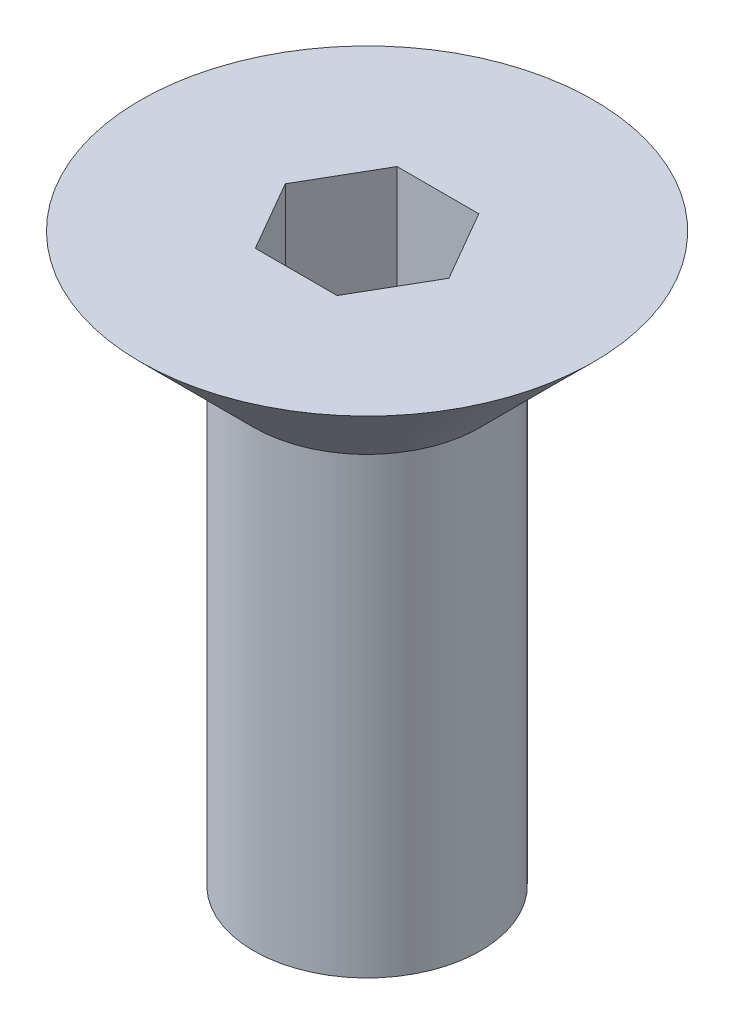
ISO-10303-21;
HEADER;
FILE_DESCRIPTION(('STEP AP214'),'2;1');
FILE_NAME('part.step','',(''),(''),'','','');
FILE_SCHEMA(('AUTOMOTIVE_DESIGN { 1 0 10303 214 1 1 1 1 }'));
ENDSEC;
DATA;
#1=APPLICATION_CONTEXT('core data for automotive mechanical design processes');
#2=APPLICATION_PROTOCOL_DEFINITION('international standard','automotive_design',2000,#1);
#3=PRODUCT_CONTEXT('',#1,'mechanical');
#4=PRODUCT('Part','Part','',(#3));
#5=PRODUCT_RELATED_PRODUCT_CATEGORY('part','',(#4));
#6=PRODUCT_DEFINITION_FORMATION('','',#4);
#7=PRODUCT_DEFINITION_CONTEXT('part definition',#1,'design');
#8=PRODUCT_DEFINITION('design','',#6,#7);
#9=PRODUCT_DEFINITION_SHAPE('','',#8);
#10=(LENGTH_UNIT() NAMED_UNIT(*) SI_UNIT(.MILLI.,.METRE.));
#11=(NAMED_UNIT(*) PLANE_ANGLE_UNIT() SI_UNIT($,.RADIAN.));
#12=(NAMED_UNIT(*) SI_UNIT($,.STERADIAN.) SOLID_ANGLE_UNIT());
#13=UNCERTAINTY_MEASURE_WITH_UNIT(LENGTH_MEASURE(1.E-05),#10,'distance_accuracy_value','');
#14=(GEOMETRIC_REPRESENTATION_CONTEXT(3) GLOBAL_UNCERTAINTY_ASSIGNED_CONTEXT((#13)) GLOBAL_UNIT_ASSIGNED_CONTEXT((#10,
#11,#12)) REPRESENTATION_CONTEXT('',''));
#15=CARTESIAN_POINT('',(0.,0.,0.));
#16=DIRECTION('',(0.,0.,1.));
#17=DIRECTION('',(1.,0.,0.));
#18=AXIS2_PLACEMENT_3D('',#15,#16,#17);
#19=CARTESIAN_POINT('',(0.,-20.,0.));
#20=DIRECTION('',(0.,1.,0.));
#21=DIRECTION('',(0.,0.,1.));
#22=AXIS2_PLACEMENT_3D('',#19,#20,#21);
#23=PLANE('',#22);
#24=CARTESIAN_POINT('',(0.,-20.,0.));
#25=DIRECTION('',(0.,1.,0.));
#26=DIRECTION('',(0.,0.,1.));
#27=AXIS2_PLACEMENT_3D('',#24,#25,#26);
#28=CIRCLE('',#27,4.00000000000001);
#29=CARTESIAN_POINT('',(0.,-20.,4.00000000000001));
#30=VERTEX_POINT('',#29);
#31=EDGE_CURVE('E11',#30,#30,#28,.T.);
#32=ORIENTED_EDGE('',*,*,#31,.F.);
#33=EDGE_LOOP('',(#32));
#34=FACE_BOUND('',#33,.T.);
#35=ADVANCED_FACE('F34',(#34),#23,.F.);
#36=CARTESIAN_POINT('',(0.,61.6916426261037,0.));
#37=DIRECTION('',(0.,1.,0.));
#38=DIRECTION('',(0.,0.,1.));
#39=AXIS2_PLACEMENT_3D('',#36,#37,#38);
#40=CYLINDRICAL_SURFACE('',#39,4.00000000000001);
#41=CARTESIAN_POINT('',(0.,-4.,0.));
#42=DIRECTION('',(0.,1.,0.));
#43=DIRECTION('',(0.,0.,1.));
#44=AXIS2_PLACEMENT_3D('',#41,#42,#43);
#45=CIRCLE('',#44,4.00000000000001);
#46=CARTESIAN_POINT('',(0.,-4.,4.00000000000001));
#47=VERTEX_POINT('',#46);
#48=EDGE_CURVE('E41',#47,#47,#45,.T.);
#49=ORIENTED_EDGE('',*,*,#48,.F.);
#50=EDGE_LOOP('',(#49));
#51=FACE_BOUND('',#50,.T.);
#52=ORIENTED_EDGE('',*,*,#31,.T.);
#53=EDGE_LOOP('',(#52));
#54=FACE_BOUND('',#53,.T.);
#55=ADVANCED_FACE('F147',(#51,#54),#40,.T.);
#56=CARTESIAN_POINT('',(0.,-4.,0.));
#57=DIRECTION('',(0.,1.,0.));
#58=DIRECTION('',(0.,0.,1.));
#59=AXIS2_PLACEMENT_3D('',#56,#57,#58);
#60=CONICAL_SURFACE('',#59,4.00000000000001,0.785398163397448);
#61=CARTESIAN_POINT('',(0.,0.,0.));
#62=DIRECTION('',(0.,1.,0.));
#63=DIRECTION('',(0.,0.,1.));
#64=AXIS2_PLACEMENT_3D('',#61,#62,#63);
#65=CIRCLE('',#64,8.00000000000001);
#66=CARTESIAN_POINT('',(0.,0.,8.00000000000001));
#67=VERTEX_POINT('',#66);
#68=EDGE_CURVE('E135',#67,#67,#65,.T.);
#69=ORIENTED_EDGE('',*,*,#68,.F.);
#70=EDGE_LOOP('',(#69));
#71=FACE_BOUND('',#70,.T.);
#72=ORIENTED_EDGE('',*,*,#48,.T.);
#73=EDGE_LOOP('',(#72));
#74=FACE_BOUND('',#73,.T.);
#75=ADVANCED_FACE('F145',(#71,#74),#60,.T.);
#76=CARTESIAN_POINT('',(8.00000000000001,0.,0.));
#77=DIRECTION('',(0.,-1.,0.));
#78=DIRECTION('',(0.,0.,-1.));
#79=AXIS2_PLACEMENT_3D('',#76,#77,#78);
#80=PLANE('',#79);
#81=DIRECTION('',(-1.,0.,0.));
#82=VECTOR('',#81,1.);
#83=CARTESIAN_POINT('',(1.44337567297406,0.,-2.5));
#84=LINE('',#83,#82);
#85=CARTESIAN_POINT('',(1.44337567297406,0.,-2.5));
#86=VERTEX_POINT('',#85);
#87=CARTESIAN_POINT('',(-1.44337567297406,0.,-2.5));
#88=VERTEX_POINT('',#87);
#89=EDGE_CURVE('E122',#86,#88,#84,.T.);
#90=ORIENTED_EDGE('',*,*,#89,.F.);
#91=DIRECTION('',(-0.5,0.,-0.866025403784439));
#92=VECTOR('',#91,1.);
#93=CARTESIAN_POINT('',(2.88675134594813,0.,0.));
#94=LINE('',#93,#92);
#95=CARTESIAN_POINT('',(2.88675134594813,0.,0.));
#96=VERTEX_POINT('',#95);
#97=EDGE_CURVE('E48',#96,#86,#94,.T.);
#98=ORIENTED_EDGE('',*,*,#97,.F.);
#99=DIRECTION('',(0.5,0.,-0.866025403784439));
#100=VECTOR('',#99,1.);
#101=CARTESIAN_POINT('',(1.44337567297407,0.,2.5));
#102=LINE('',#101,#100);
#103=CARTESIAN_POINT('',(1.44337567297407,0.,2.5));
#104=VERTEX_POINT('',#103);
#105=EDGE_CURVE('E131',#104,#96,#102,.T.);
#106=ORIENTED_EDGE('',*,*,#105,.F.);
#107=DIRECTION('',(1.,0.,0.));
#108=VECTOR('',#107,1.);
#109=CARTESIAN_POINT('',(-1.44337567297406,0.,2.5));
#110=LINE('',#109,#108);
#111=CARTESIAN_POINT('',(-1.44337567297406,0.,2.5));
#112=VERTEX_POINT('',#111);
#113=EDGE_CURVE('E129',#112,#104,#110,.T.);
#114=ORIENTED_EDGE('',*,*,#113,.F.);
#115=DIRECTION('',(0.5,0.,0.866025403784439));
#116=VECTOR('',#115,1.);
#117=CARTESIAN_POINT('',(-2.88675134594813,0.,0.));
#118=LINE('',#117,#116);
#119=CARTESIAN_POINT('',(-2.88675134594813,0.,0.));
#120=VERTEX_POINT('',#119);
#121=EDGE_CURVE('E96',#120,#112,#118,.T.);
#122=ORIENTED_EDGE('',*,*,#121,.F.);
#123=DIRECTION('',(-0.5,0.,0.866025403784439));
#124=VECTOR('',#123,1.);
#125=CARTESIAN_POINT('',(-1.44337567297406,0.,-2.5));
#126=LINE('',#125,#124);
#127=EDGE_CURVE('E125',#88,#120,#126,.T.);
#128=ORIENTED_EDGE('',*,*,#127,.F.);
#129=EDGE_LOOP('',(#90,#98,#106,#114,#122,#128));
#130=FACE_BOUND('',#129,.T.);
#131=ORIENTED_EDGE('',*,*,#68,.T.);
#132=EDGE_LOOP('',(#131));
#133=FACE_BOUND('',#132,.T.);
#134=ADVANCED_FACE('F165',(#130,#133),#80,.F.);
#135=CARTESIAN_POINT('',(2.88675134594813,-5.,0.));
#136=DIRECTION('',(0.866025403784439,0.,-0.5));
#137=DIRECTION('',(-0.5,0.,-0.866025403784439));
#138=AXIS2_PLACEMENT_3D('',#135,#136,#137);
#139=PLANE('',#138);
#140=ORIENTED_EDGE('',*,*,#97,.T.);
#141=DIRECTION('',(0.,1.,0.));
#142=VECTOR('',#141,1.);
#143=CARTESIAN_POINT('',(1.44337567297406,-5.,-2.5));
#144=LINE('',#143,#142);
#145=CARTESIAN_POINT('',(1.44337567297406,-5.,-2.5));
#146=VERTEX_POINT('',#145);
#147=EDGE_CURVE('E78',#146,#86,#144,.T.);
#148=ORIENTED_EDGE('',*,*,#147,.F.);
#149=DIRECTION('',(-0.5,0.,-0.866025403784439));
#150=VECTOR('',#149,1.);
#151=CARTESIAN_POINT('',(2.88675134594813,-5.,0.));
#152=LINE('',#151,#150);
#153=CARTESIAN_POINT('',(2.88675134594813,-5.,0.));
#154=VERTEX_POINT('',#153);
#155=EDGE_CURVE('E133',#154,#146,#152,.T.);
#156=ORIENTED_EDGE('',*,*,#155,.F.);
#157=DIRECTION('',(0.,1.,0.));
#158=VECTOR('',#157,1.);
#159=CARTESIAN_POINT('',(2.88675134594813,-5.,0.));
#160=LINE('',#159,#158);
#161=EDGE_CURVE('E56',#154,#96,#160,.T.);
#162=ORIENTED_EDGE('',*,*,#161,.T.);
#163=EDGE_LOOP('',(#140,#148,#156,#162));
#164=FACE_BOUND('',#163,.T.);
#165=ADVANCED_FACE('F173',(#164),#139,.F.);
#166=CARTESIAN_POINT('',(1.44337567297407,-5.,2.5));
#167=DIRECTION('',(0.866025403784439,0.,0.5));
#168=DIRECTION('',(0.5,0.,-0.866025403784439));
#169=AXIS2_PLACEMENT_3D('',#166,#167,#168);
#170=PLANE('',#169);
#171=ORIENTED_EDGE('',*,*,#105,.T.);
#172=ORIENTED_EDGE('',*,*,#161,.F.);
#173=DIRECTION('',(0.5,0.,-0.866025403784439));
#174=VECTOR('',#173,1.);
#175=CARTESIAN_POINT('',(1.44337567297407,-5.,2.5));
#176=LINE('',#175,#174);
#177=CARTESIAN_POINT('',(1.44337567297407,-5.,2.5));
#178=VERTEX_POINT('',#177);
#179=EDGE_CURVE('E108',#178,#154,#176,.T.);
#180=ORIENTED_EDGE('',*,*,#179,.F.);
#181=DIRECTION('',(0.,1.,0.));
#182=VECTOR('',#181,1.);
#183=CARTESIAN_POINT('',(1.44337567297407,-5.,2.5));
#184=LINE('',#183,#182);
#185=EDGE_CURVE('E100',#178,#104,#184,.T.);
#186=ORIENTED_EDGE('',*,*,#185,.T.);
#187=EDGE_LOOP('',(#171,#172,#180,#186));
#188=FACE_BOUND('',#187,.T.);
#189=ADVANCED_FACE('F181',(#188),#170,.F.);
#190=CARTESIAN_POINT('',(-1.44337567297406,-5.,2.5));
#191=DIRECTION('',(0.,0.,1.));
#192=DIRECTION('',(1.,0.,0.));
#193=AXIS2_PLACEMENT_3D('',#190,#191,#192);
#194=PLANE('',#193);
#195=ORIENTED_EDGE('',*,*,#113,.T.);
#196=ORIENTED_EDGE('',*,*,#185,.F.);
#197=DIRECTION('',(1.,0.,0.));
#198=VECTOR('',#197,1.);
#199=CARTESIAN_POINT('',(-1.44337567297406,-5.,2.5));
#200=LINE('',#199,#198);
#201=CARTESIAN_POINT('',(-1.44337567297406,-5.,2.5));
#202=VERTEX_POINT('',#201);
#203=EDGE_CURVE('E104',#202,#178,#200,.T.);
#204=ORIENTED_EDGE('',*,*,#203,.F.);
#205=DIRECTION('',(0.,1.,0.));
#206=VECTOR('',#205,1.);
#207=CARTESIAN_POINT('',(-1.44337567297406,-5.,2.5));
#208=LINE('',#207,#206);
#209=EDGE_CURVE('E89',#202,#112,#208,.T.);
#210=ORIENTED_EDGE('',*,*,#209,.T.);
#211=EDGE_LOOP('',(#195,#196,#204,#210));
#212=FACE_BOUND('',#211,.T.);
#213=ADVANCED_FACE('F105',(#212),#194,.F.);
#214=CARTESIAN_POINT('',(-2.88675134594813,-5.,0.));
#215=DIRECTION('',(-0.866025403784438,0.,0.5));
#216=DIRECTION('',(0.5,0.,0.866025403784438));
#217=AXIS2_PLACEMENT_3D('',#214,#215,#216);
#218=PLANE('',#217);
#219=ORIENTED_EDGE('',*,*,#121,.T.);
#220=ORIENTED_EDGE('',*,*,#209,.F.);
#221=DIRECTION('',(0.5,0.,0.866025403784439));
#222=VECTOR('',#221,1.);
#223=CARTESIAN_POINT('',(-2.88675134594813,-5.,0.));
#224=LINE('',#223,#222);
#225=CARTESIAN_POINT('',(-2.88675134594813,-5.,0.));
#226=VERTEX_POINT('',#225);
#227=EDGE_CURVE('E93',#226,#202,#224,.T.);
#228=ORIENTED_EDGE('',*,*,#227,.F.);
#229=DIRECTION('',(0.,1.,0.));
#230=VECTOR('',#229,1.);
#231=CARTESIAN_POINT('',(-2.88675134594813,-5.,0.));
#232=LINE('',#231,#230);
#233=EDGE_CURVE('E101',#226,#120,#232,.T.);
#234=ORIENTED_EDGE('',*,*,#233,.T.);
#235=EDGE_LOOP('',(#219,#220,#228,#234));
#236=FACE_BOUND('',#235,.T.);
#237=ADVANCED_FACE('F91',(#236),#218,.F.);
#238=CARTESIAN_POINT('',(-1.44337567297406,-5.,-2.5));
#239=DIRECTION('',(-0.866025403784439,0.,-0.5));
#240=DIRECTION('',(-0.5,0.,0.866025403784439));
#241=AXIS2_PLACEMENT_3D('',#238,#239,#240);
#242=PLANE('',#241);
#243=ORIENTED_EDGE('',*,*,#127,.T.);
#244=ORIENTED_EDGE('',*,*,#233,.F.);
#245=DIRECTION('',(-0.5,0.,0.866025403784439));
#246=VECTOR('',#245,1.);
#247=CARTESIAN_POINT('',(-1.44337567297406,-5.,-2.5));
#248=LINE('',#247,#246);
#249=CARTESIAN_POINT('',(-1.44337567297406,-5.,-2.5));
#250=VERTEX_POINT('',#249);
#251=EDGE_CURVE('E114',#250,#226,#248,.T.);
#252=ORIENTED_EDGE('',*,*,#251,.F.);
#253=DIRECTION('',(0.,1.,0.));
#254=VECTOR('',#253,1.);
#255=CARTESIAN_POINT('',(-1.44337567297406,-5.,-2.5));
#256=LINE('',#255,#254);
#257=EDGE_CURVE('E138',#250,#88,#256,.T.);
#258=ORIENTED_EDGE('',*,*,#257,.T.);
#259=EDGE_LOOP('',(#243,#244,#252,#258));
#260=FACE_BOUND('',#259,.T.);
#261=ADVANCED_FACE('F200',(#260),#242,.F.);
#262=CARTESIAN_POINT('',(1.44337567297406,-5.,-2.5));
#263=DIRECTION('',(0.,0.,-1.));
#264=DIRECTION('',(-1.,0.,0.));
#265=AXIS2_PLACEMENT_3D('',#262,#263,#264);
#266=PLANE('',#265);
#267=ORIENTED_EDGE('',*,*,#89,.T.);
#268=ORIENTED_EDGE('',*,*,#257,.F.);
#269=DIRECTION('',(-1.,0.,0.));
#270=VECTOR('',#269,1.);
#271=CARTESIAN_POINT('',(1.44337567297406,-5.,-2.5));
#272=LINE('',#271,#270);
#273=EDGE_CURVE('E116',#146,#250,#272,.T.);
#274=ORIENTED_EDGE('',*,*,#273,.F.);
#275=ORIENTED_EDGE('',*,*,#147,.T.);
#276=EDGE_LOOP('',(#267,#268,#274,#275));
#277=FACE_BOUND('',#276,.T.);
#278=ADVANCED_FACE('F207',(#277),#266,.F.);
#279=CARTESIAN_POINT('',(4.33012701892219,-5.,2.5));
#280=DIRECTION('',(0.,-1.,0.));
#281=DIRECTION('',(0.,0.,-1.));
#282=AXIS2_PLACEMENT_3D('',#279,#280,#281);
#283=PLANE('',#282);
#284=ORIENTED_EDGE('',*,*,#155,.T.);
#285=ORIENTED_EDGE('',*,*,#273,.T.);
#286=ORIENTED_EDGE('',*,*,#251,.T.);
#287=ORIENTED_EDGE('',*,*,#227,.T.);
#288=ORIENTED_EDGE('',*,*,#203,.T.);
#289=ORIENTED_EDGE('',*,*,#179,.T.);
#290=EDGE_LOOP('',(#284,#285,#286,#287,#288,#289));
#291=FACE_BOUND('',#290,.T.);
#292=ADVANCED_FACE('F111',(#291),#283,.F.);
#293=CLOSED_SHELL('',(#35,#55,#75,#134,#165,#189,#213,#237,#261,#278,#292));
#294=MANIFOLD_SOLID_BREP('B2',#293);
#295=ADVANCED_BREP_SHAPE_REPRESENTATION('',(#18,#294),#14);
#296=SHAPE_DEFINITION_REPRESENTATION(#9,#295);
ENDSEC;
END-ISO-10303-21;
